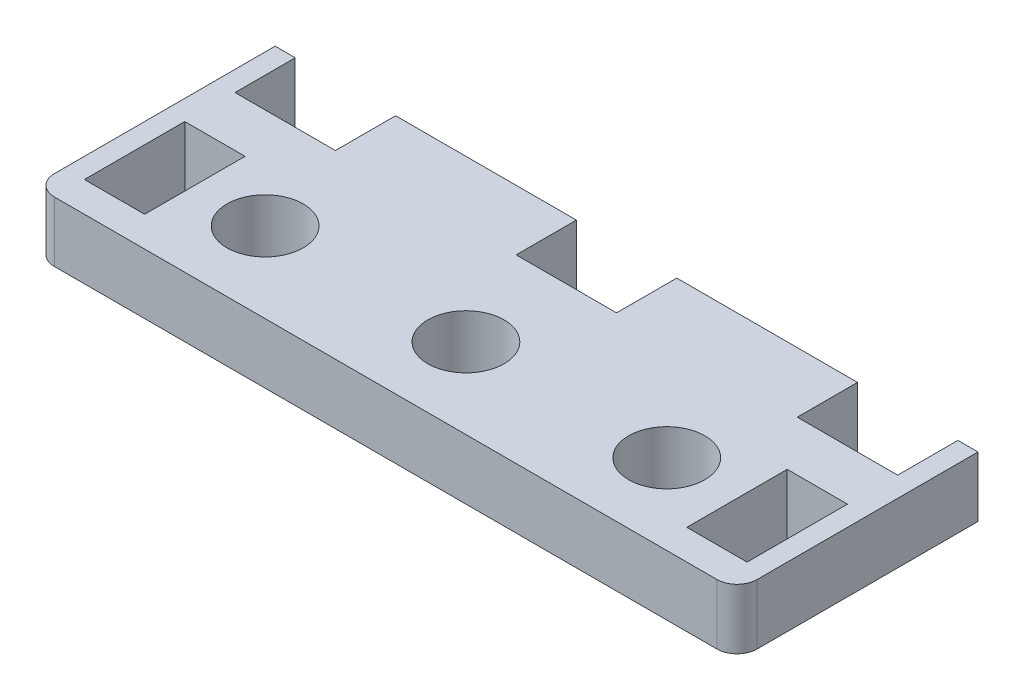
ISO-10303-21;
HEADER;
FILE_DESCRIPTION(('STEP AP214'),'2;1');
FILE_NAME('part.step','',(''),(''),'','','');
FILE_SCHEMA(('AUTOMOTIVE_DESIGN { 1 0 10303 214 1 1 1 1 }'));
ENDSEC;
DATA;
#1=APPLICATION_CONTEXT('core data for automotive mechanical design processes');
#2=APPLICATION_PROTOCOL_DEFINITION('international standard','automotive_design',2000,#1);
#3=PRODUCT_CONTEXT('',#1,'mechanical');
#4=PRODUCT('Part','Part','',(#3));
#5=PRODUCT_RELATED_PRODUCT_CATEGORY('part','',(#4));
#6=PRODUCT_DEFINITION_FORMATION('','',#4);
#7=PRODUCT_DEFINITION_CONTEXT('part definition',#1,'design');
#8=PRODUCT_DEFINITION('design','',#6,#7);
#9=PRODUCT_DEFINITION_SHAPE('','',#8);
#10=(LENGTH_UNIT() NAMED_UNIT(*) SI_UNIT(.MILLI.,.METRE.));
#11=(NAMED_UNIT(*) PLANE_ANGLE_UNIT() SI_UNIT($,.RADIAN.));
#12=(NAMED_UNIT(*) SI_UNIT($,.STERADIAN.) SOLID_ANGLE_UNIT());
#13=UNCERTAINTY_MEASURE_WITH_UNIT(LENGTH_MEASURE(1.E-05),#10,'distance_accuracy_value','');
#14=(GEOMETRIC_REPRESENTATION_CONTEXT(3) GLOBAL_UNCERTAINTY_ASSIGNED_CONTEXT((#13)) GLOBAL_UNIT_ASSIGNED_CONTEXT((#10,
#11,#12)) REPRESENTATION_CONTEXT('',''));
#15=CARTESIAN_POINT('',(0.,0.,0.));
#16=DIRECTION('',(0.,0.,1.));
#17=DIRECTION('',(1.,0.,0.));
#18=AXIS2_PLACEMENT_3D('',#15,#16,#17);
#19=CARTESIAN_POINT('',(-17.5,3.,-6.));
#20=DIRECTION('',(0.,0.,-1.));
#21=DIRECTION('',(-1.,0.,0.));
#22=AXIS2_PLACEMENT_3D('',#19,#20,#21);
#23=PLANE('',#22);
#24=DIRECTION('',(0.,1.,0.));
#25=VECTOR('',#24,1.);
#26=CARTESIAN_POINT('',(-2.5,0.,-6.));
#27=LINE('',#26,#25);
#28=CARTESIAN_POINT('',(-2.5,0.,-6.));
#29=VERTEX_POINT('',#28);
#30=CARTESIAN_POINT('',(-2.5,3.,-6.));
#31=VERTEX_POINT('',#30);
#32=EDGE_CURVE('E296',#29,#31,#27,.T.);
#33=ORIENTED_EDGE('',*,*,#32,.F.);
#34=DIRECTION('',(1.,0.,0.));
#35=VECTOR('',#34,1.);
#36=CARTESIAN_POINT('',(-17.5,0.,-6.));
#37=LINE('',#36,#35);
#38=CARTESIAN_POINT('',(-11.5,0.,-6.));
#39=VERTEX_POINT('',#38);
#40=EDGE_CURVE('E384',#39,#29,#37,.T.);
#41=ORIENTED_EDGE('',*,*,#40,.F.);
#42=DIRECTION('',(0.,1.,0.));
#43=VECTOR('',#42,1.);
#44=CARTESIAN_POINT('',(-11.5,0.,-6.));
#45=LINE('',#44,#43);
#46=CARTESIAN_POINT('',(-11.5,3.,-6.));
#47=VERTEX_POINT('',#46);
#48=EDGE_CURVE('E250',#39,#47,#45,.T.);
#49=ORIENTED_EDGE('',*,*,#48,.T.);
#50=DIRECTION('',(1.,0.,0.));
#51=VECTOR('',#50,1.);
#52=CARTESIAN_POINT('',(-17.5,3.,-6.));
#53=LINE('',#52,#51);
#54=EDGE_CURVE('E373',#47,#31,#53,.T.);
#55=ORIENTED_EDGE('',*,*,#54,.T.);
#56=EDGE_LOOP('',(#33,#41,#49,#55));
#57=FACE_BOUND('',#56,.T.);
#58=ADVANCED_FACE('F33',(#57),#23,.T.);
#59=DIRECTION('',(0.,1.,0.));
#60=VECTOR('',#59,1.);
#61=CARTESIAN_POINT('',(-16.5,0.,-6.));
#62=LINE('',#61,#60);
#63=CARTESIAN_POINT('',(-16.5,0.,-6.));
#64=VERTEX_POINT('',#63);
#65=CARTESIAN_POINT('',(-16.5,3.,-6.));
#66=VERTEX_POINT('',#65);
#67=EDGE_CURVE('E247',#64,#66,#62,.T.);
#68=ORIENTED_EDGE('',*,*,#67,.F.);
#69=CARTESIAN_POINT('',(-17.5,0.,-6.));
#70=VERTEX_POINT('',#69);
#71=EDGE_CURVE('E234',#70,#64,#37,.T.);
#72=ORIENTED_EDGE('',*,*,#71,.F.);
#73=DIRECTION('',(0.,-1.,0.));
#74=VECTOR('',#73,1.);
#75=CARTESIAN_POINT('',(-17.5,3.,-6.));
#76=LINE('',#75,#74);
#77=CARTESIAN_POINT('',(-17.5,3.,-6.));
#78=VERTEX_POINT('',#77);
#79=EDGE_CURVE('E390',#78,#70,#76,.T.);
#80=ORIENTED_EDGE('',*,*,#79,.F.);
#81=EDGE_CURVE('E369',#78,#66,#53,.T.);
#82=ORIENTED_EDGE('',*,*,#81,.T.);
#83=EDGE_LOOP('',(#68,#72,#80,#82));
#84=FACE_BOUND('',#83,.T.);
#85=ADVANCED_FACE('F426',(#84),#23,.T.);
#86=DIRECTION('',(0.,1.,0.));
#87=VECTOR('',#86,1.);
#88=CARTESIAN_POINT('',(2.5,0.,-6.));
#89=LINE('',#88,#87);
#90=CARTESIAN_POINT('',(2.5,0.,-6.));
#91=VERTEX_POINT('',#90);
#92=CARTESIAN_POINT('',(2.5,3.,-6.));
#93=VERTEX_POINT('',#92);
#94=EDGE_CURVE('E331',#91,#93,#89,.T.);
#95=ORIENTED_EDGE('',*,*,#94,.T.);
#96=CARTESIAN_POINT('',(11.5,3.,-6.));
#97=VERTEX_POINT('',#96);
#98=EDGE_CURVE('E444',#93,#97,#53,.T.);
#99=ORIENTED_EDGE('',*,*,#98,.T.);
#100=DIRECTION('',(0.,1.,0.));
#101=VECTOR('',#100,1.);
#102=CARTESIAN_POINT('',(11.5,0.,-6.));
#103=LINE('',#102,#101);
#104=CARTESIAN_POINT('',(11.5,0.,-6.));
#105=VERTEX_POINT('',#104);
#106=EDGE_CURVE('E245',#105,#97,#103,.T.);
#107=ORIENTED_EDGE('',*,*,#106,.F.);
#108=EDGE_CURVE('E437',#91,#105,#37,.T.);
#109=ORIENTED_EDGE('',*,*,#108,.F.);
#110=EDGE_LOOP('',(#95,#99,#107,#109));
#111=FACE_BOUND('',#110,.T.);
#112=ADVANCED_FACE('F449',(#111),#23,.T.);
#113=DIRECTION('',(0.,1.,0.));
#114=VECTOR('',#113,1.);
#115=CARTESIAN_POINT('',(16.5,0.,-6.));
#116=LINE('',#115,#114);
#117=CARTESIAN_POINT('',(16.5,0.,-6.));
#118=VERTEX_POINT('',#117);
#119=CARTESIAN_POINT('',(16.5,3.,-6.));
#120=VERTEX_POINT('',#119);
#121=EDGE_CURVE('E273',#118,#120,#116,.T.);
#122=ORIENTED_EDGE('',*,*,#121,.T.);
#123=CARTESIAN_POINT('',(17.5,3.,-6.));
#124=VERTEX_POINT('',#123);
#125=EDGE_CURVE('E374',#120,#124,#53,.T.);
#126=ORIENTED_EDGE('',*,*,#125,.T.);
#127=DIRECTION('',(0.,-1.,0.));
#128=VECTOR('',#127,1.);
#129=CARTESIAN_POINT('',(17.5,3.,-6.));
#130=LINE('',#129,#128);
#131=CARTESIAN_POINT('',(17.5,0.,-6.));
#132=VERTEX_POINT('',#131);
#133=EDGE_CURVE('E381',#124,#132,#130,.T.);
#134=ORIENTED_EDGE('',*,*,#133,.T.);
#135=EDGE_CURVE('E362',#118,#132,#37,.T.);
#136=ORIENTED_EDGE('',*,*,#135,.F.);
#137=EDGE_LOOP('',(#122,#126,#134,#136));
#138=FACE_BOUND('',#137,.T.);
#139=ADVANCED_FACE('F442',(#138),#23,.T.);
#140=CARTESIAN_POINT('',(-17.5,3.,-6.));
#141=DIRECTION('',(1.,0.,0.));
#142=DIRECTION('',(0.,0.,-1.));
#143=AXIS2_PLACEMENT_3D('',#140,#141,#142);
#144=PLANE('',#143);
#145=DIRECTION('',(0.,0.,1.));
#146=VECTOR('',#145,1.);
#147=CARTESIAN_POINT('',(-17.5,0.,-6.));
#148=LINE('',#147,#146);
#149=CARTESIAN_POINT('',(-17.5,0.,5.));
#150=VERTEX_POINT('',#149);
#151=EDGE_CURVE('E388',#70,#150,#148,.T.);
#152=ORIENTED_EDGE('',*,*,#151,.T.);
#153=DIRECTION('',(0.,-1.,0.));
#154=VECTOR('',#153,1.);
#155=CARTESIAN_POINT('',(-17.5,3.,5.));
#156=LINE('',#155,#154);
#157=CARTESIAN_POINT('',(-17.5,3.,5.));
#158=VERTEX_POINT('',#157);
#159=EDGE_CURVE('E11',#150,#158,#156,.F.);
#160=ORIENTED_EDGE('',*,*,#159,.T.);
#161=DIRECTION('',(0.,0.,1.));
#162=VECTOR('',#161,1.);
#163=CARTESIAN_POINT('',(-17.5,3.,-6.));
#164=LINE('',#163,#162);
#165=EDGE_CURVE('E379',#78,#158,#164,.T.);
#166=ORIENTED_EDGE('',*,*,#165,.F.);
#167=ORIENTED_EDGE('',*,*,#79,.T.);
#168=EDGE_LOOP('',(#152,#160,#166,#167));
#169=FACE_BOUND('',#168,.T.);
#170=ADVANCED_FACE('F423',(#169),#144,.F.);
#171=CARTESIAN_POINT('',(-17.5,3.,6.));
#172=DIRECTION('',(0.,0.,-1.));
#173=DIRECTION('',(-1.,0.,0.));
#174=AXIS2_PLACEMENT_3D('',#171,#172,#173);
#175=PLANE('',#174);
#176=DIRECTION('',(1.,0.,0.));
#177=VECTOR('',#176,1.);
#178=CARTESIAN_POINT('',(-17.5,0.,6.));
#179=LINE('',#178,#177);
#180=CARTESIAN_POINT('',(-16.5,0.,6.));
#181=VERTEX_POINT('',#180);
#182=CARTESIAN_POINT('',(16.5,0.,6.));
#183=VERTEX_POINT('',#182);
#184=EDGE_CURVE('E386',#181,#183,#179,.T.);
#185=ORIENTED_EDGE('',*,*,#184,.T.);
#186=DIRECTION('',(0.,-1.,0.));
#187=VECTOR('',#186,1.);
#188=CARTESIAN_POINT('',(16.5,3.,6.));
#189=LINE('',#188,#187);
#190=CARTESIAN_POINT('',(16.5,3.,6.));
#191=VERTEX_POINT('',#190);
#192=EDGE_CURVE('E54',#183,#191,#189,.F.);
#193=ORIENTED_EDGE('',*,*,#192,.T.);
#194=DIRECTION('',(1.,0.,0.));
#195=VECTOR('',#194,1.);
#196=CARTESIAN_POINT('',(-17.5,3.,6.));
#197=LINE('',#196,#195);
#198=CARTESIAN_POINT('',(-16.5,3.,6.));
#199=VERTEX_POINT('',#198);
#200=EDGE_CURVE('E377',#199,#191,#197,.T.);
#201=ORIENTED_EDGE('',*,*,#200,.F.);
#202=DIRECTION('',(0.,-1.,0.));
#203=VECTOR('',#202,1.);
#204=CARTESIAN_POINT('',(-16.5,3.,6.));
#205=LINE('',#204,#203);
#206=EDGE_CURVE('E401',#199,#181,#205,.T.);
#207=ORIENTED_EDGE('',*,*,#206,.T.);
#208=EDGE_LOOP('',(#185,#193,#201,#207));
#209=FACE_BOUND('',#208,.T.);
#210=ADVANCED_FACE('F419',(#209),#175,.F.);
#211=CARTESIAN_POINT('',(17.5,3.,-6.));
#212=DIRECTION('',(1.,0.,0.));
#213=DIRECTION('',(0.,0.,-1.));
#214=AXIS2_PLACEMENT_3D('',#211,#212,#213);
#215=PLANE('',#214);
#216=DIRECTION('',(0.,0.,1.));
#217=VECTOR('',#216,1.);
#218=CARTESIAN_POINT('',(17.5,3.,-6.));
#219=LINE('',#218,#217);
#220=CARTESIAN_POINT('',(17.5,3.,5.));
#221=VERTEX_POINT('',#220);
#222=EDGE_CURVE('E372',#124,#221,#219,.T.);
#223=ORIENTED_EDGE('',*,*,#222,.T.);
#224=DIRECTION('',(0.,-1.,0.));
#225=VECTOR('',#224,1.);
#226=CARTESIAN_POINT('',(17.5,0.,5.));
#227=LINE('',#226,#225);
#228=CARTESIAN_POINT('',(17.5,0.,5.));
#229=VERTEX_POINT('',#228);
#230=EDGE_CURVE('E392',#221,#229,#227,.T.);
#231=ORIENTED_EDGE('',*,*,#230,.T.);
#232=DIRECTION('',(0.,0.,1.));
#233=VECTOR('',#232,1.);
#234=CARTESIAN_POINT('',(17.5,0.,-6.));
#235=LINE('',#234,#233);
#236=EDGE_CURVE('E383',#132,#229,#235,.T.);
#237=ORIENTED_EDGE('',*,*,#236,.F.);
#238=ORIENTED_EDGE('',*,*,#133,.F.);
#239=EDGE_LOOP('',(#223,#231,#237,#238));
#240=FACE_BOUND('',#239,.T.);
#241=ADVANCED_FACE('F415',(#240),#215,.T.);
#242=CARTESIAN_POINT('',(0.,3.,0.));
#243=DIRECTION('',(0.,-1.,0.));
#244=DIRECTION('',(0.,0.,-1.));
#245=AXIS2_PLACEMENT_3D('',#242,#243,#244);
#246=PLANE('',#245);
#247=CARTESIAN_POINT('',(-10.,3.,2.));
#248=DIRECTION('',(0.,1.,0.));
#249=DIRECTION('',(0.,0.,1.));
#250=AXIS2_PLACEMENT_3D('',#247,#248,#249);
#251=CIRCLE('',#250,1.89864999999999);
#252=CARTESIAN_POINT('',(-10.,3.,3.89864999999999));
#253=VERTEX_POINT('',#252);
#254=EDGE_CURVE('E695',#253,#253,#251,.T.);
#255=ORIENTED_EDGE('',*,*,#254,.F.);
#256=EDGE_LOOP('',(#255));
#257=FACE_BOUND('',#256,.T.);
#258=CARTESIAN_POINT('',(0.,3.,2.));
#259=DIRECTION('',(0.,1.,0.));
#260=DIRECTION('',(0.,0.,1.));
#261=AXIS2_PLACEMENT_3D('',#258,#259,#260);
#262=CIRCLE('',#261,1.89864999999999);
#263=CARTESIAN_POINT('',(0.,3.,3.89864999999999));
#264=VERTEX_POINT('',#263);
#265=EDGE_CURVE('E698',#264,#264,#262,.T.);
#266=ORIENTED_EDGE('',*,*,#265,.F.);
#267=EDGE_LOOP('',(#266));
#268=FACE_BOUND('',#267,.T.);
#269=CARTESIAN_POINT('',(10.,3.,2.));
#270=DIRECTION('',(0.,1.,0.));
#271=DIRECTION('',(0.,0.,1.));
#272=AXIS2_PLACEMENT_3D('',#269,#270,#271);
#273=CIRCLE('',#272,1.89864999999999);
#274=CARTESIAN_POINT('',(10.,3.,3.89864999999999));
#275=VERTEX_POINT('',#274);
#276=EDGE_CURVE('E705',#275,#275,#273,.T.);
#277=ORIENTED_EDGE('',*,*,#276,.F.);
#278=EDGE_LOOP('',(#277));
#279=FACE_BOUND('',#278,.T.);
#280=DIRECTION('',(-1.,0.,0.));
#281=VECTOR('',#280,1.);
#282=CARTESIAN_POINT('',(13.5,3.,-0.499999999999998));
#283=LINE('',#282,#281);
#284=CARTESIAN_POINT('',(16.5,3.,-0.499999999999998));
#285=VERTEX_POINT('',#284);
#286=CARTESIAN_POINT('',(13.5,3.,-0.499999999999998));
#287=VERTEX_POINT('',#286);
#288=EDGE_CURVE('E295',#285,#287,#283,.T.);
#289=ORIENTED_EDGE('',*,*,#288,.F.);
#290=DIRECTION('',(0.,0.,-1.));
#291=VECTOR('',#290,1.);
#292=CARTESIAN_POINT('',(16.5,3.,-0.499999999999998));
#293=LINE('',#292,#291);
#294=CARTESIAN_POINT('',(16.5,3.,4.5));
#295=VERTEX_POINT('',#294);
#296=EDGE_CURVE('E293',#295,#285,#293,.T.);
#297=ORIENTED_EDGE('',*,*,#296,.F.);
#298=DIRECTION('',(1.,0.,0.));
#299=VECTOR('',#298,1.);
#300=CARTESIAN_POINT('',(13.5,3.,4.5));
#301=LINE('',#300,#299);
#302=CARTESIAN_POINT('',(13.5,3.,4.5));
#303=VERTEX_POINT('',#302);
#304=EDGE_CURVE('E283',#303,#295,#301,.T.);
#305=ORIENTED_EDGE('',*,*,#304,.F.);
#306=DIRECTION('',(0.,0.,1.));
#307=VECTOR('',#306,1.);
#308=CARTESIAN_POINT('',(13.5,3.,-0.499999999999998));
#309=LINE('',#308,#307);
#310=EDGE_CURVE('E299',#287,#303,#309,.T.);
#311=ORIENTED_EDGE('',*,*,#310,.F.);
#312=EDGE_LOOP('',(#289,#297,#305,#311));
#313=FACE_BOUND('',#312,.T.);
#314=DIRECTION('',(-1.,0.,0.));
#315=VECTOR('',#314,1.);
#316=CARTESIAN_POINT('',(-16.5,3.,-0.5));
#317=LINE('',#316,#315);
#318=CARTESIAN_POINT('',(-13.5,3.,-0.5));
#319=VERTEX_POINT('',#318);
#320=CARTESIAN_POINT('',(-16.5,3.,-0.5));
#321=VERTEX_POINT('',#320);
#322=EDGE_CURVE('E352',#319,#321,#317,.T.);
#323=ORIENTED_EDGE('',*,*,#322,.F.);
#324=DIRECTION('',(0.,0.,-1.));
#325=VECTOR('',#324,1.);
#326=CARTESIAN_POINT('',(-13.5,3.,-0.5));
#327=LINE('',#326,#325);
#328=CARTESIAN_POINT('',(-13.5,3.,4.5));
#329=VERTEX_POINT('',#328);
#330=EDGE_CURVE('E306',#329,#319,#327,.T.);
#331=ORIENTED_EDGE('',*,*,#330,.F.);
#332=DIRECTION('',(1.,0.,0.));
#333=VECTOR('',#332,1.);
#334=CARTESIAN_POINT('',(-16.5,3.,4.5));
#335=LINE('',#334,#333);
#336=CARTESIAN_POINT('',(-16.5,3.,4.5));
#337=VERTEX_POINT('',#336);
#338=EDGE_CURVE('E341',#337,#329,#335,.T.);
#339=ORIENTED_EDGE('',*,*,#338,.F.);
#340=DIRECTION('',(0.,0.,1.));
#341=VECTOR('',#340,1.);
#342=CARTESIAN_POINT('',(-16.5,3.,-0.5));
#343=LINE('',#342,#341);
#344=EDGE_CURVE('E355',#321,#337,#343,.T.);
#345=ORIENTED_EDGE('',*,*,#344,.F.);
#346=EDGE_LOOP('',(#323,#331,#339,#345));
#347=FACE_BOUND('',#346,.T.);
#348=ORIENTED_EDGE('',*,*,#200,.T.);
#349=CARTESIAN_POINT('',(16.5,3.,5.));
#350=DIRECTION('',(0.,-1.,0.));
#351=DIRECTION('',(0.,0.,-1.));
#352=AXIS2_PLACEMENT_3D('',#349,#350,#351);
#353=CIRCLE('',#352,1.);
#354=EDGE_CURVE('E41',#191,#221,#353,.F.);
#355=ORIENTED_EDGE('',*,*,#354,.T.);
#356=ORIENTED_EDGE('',*,*,#222,.F.);
#357=ORIENTED_EDGE('',*,*,#125,.F.);
#358=DIRECTION('',(0.,0.,-1.));
#359=VECTOR('',#358,1.);
#360=CARTESIAN_POINT('',(16.5,3.,-6.));
#361=LINE('',#360,#359);
#362=CARTESIAN_POINT('',(16.5,3.,-3.));
#363=VERTEX_POINT('',#362);
#364=EDGE_CURVE('E258',#363,#120,#361,.T.);
#365=ORIENTED_EDGE('',*,*,#364,.F.);
#366=DIRECTION('',(1.,0.,0.));
#367=VECTOR('',#366,1.);
#368=CARTESIAN_POINT('',(11.5,3.,-3.));
#369=LINE('',#368,#367);
#370=CARTESIAN_POINT('',(11.5,3.,-3.));
#371=VERTEX_POINT('',#370);
#372=EDGE_CURVE('E268',#371,#363,#369,.T.);
#373=ORIENTED_EDGE('',*,*,#372,.F.);
#374=DIRECTION('',(0.,0.,1.));
#375=VECTOR('',#374,1.);
#376=CARTESIAN_POINT('',(11.5,3.,-6.));
#377=LINE('',#376,#375);
#378=EDGE_CURVE('E265',#97,#371,#377,.T.);
#379=ORIENTED_EDGE('',*,*,#378,.F.);
#380=ORIENTED_EDGE('',*,*,#98,.F.);
#381=DIRECTION('',(0.,0.,-1.));
#382=VECTOR('',#381,1.);
#383=CARTESIAN_POINT('',(2.5,3.,-6.));
#384=LINE('',#383,#382);
#385=CARTESIAN_POINT('',(2.5,3.,-3.));
#386=VERTEX_POINT('',#385);
#387=EDGE_CURVE('E317',#386,#93,#384,.T.);
#388=ORIENTED_EDGE('',*,*,#387,.F.);
#389=DIRECTION('',(1.,0.,0.));
#390=VECTOR('',#389,1.);
#391=CARTESIAN_POINT('',(-2.5,3.,-3.));
#392=LINE('',#391,#390);
#393=CARTESIAN_POINT('',(-2.5,3.,-3.));
#394=VERTEX_POINT('',#393);
#395=EDGE_CURVE('E326',#394,#386,#392,.T.);
#396=ORIENTED_EDGE('',*,*,#395,.F.);
#397=DIRECTION('',(0.,0.,1.));
#398=VECTOR('',#397,1.);
#399=CARTESIAN_POINT('',(-2.5,3.,-6.));
#400=LINE('',#399,#398);
#401=EDGE_CURVE('E249',#31,#394,#400,.T.);
#402=ORIENTED_EDGE('',*,*,#401,.F.);
#403=ORIENTED_EDGE('',*,*,#54,.F.);
#404=DIRECTION('',(0.,0.,-1.));
#405=VECTOR('',#404,1.);
#406=CARTESIAN_POINT('',(-11.5,3.,-6.));
#407=LINE('',#406,#405);
#408=CARTESIAN_POINT('',(-11.5,3.,-3.));
#409=VERTEX_POINT('',#408);
#410=EDGE_CURVE('E235',#409,#47,#407,.T.);
#411=ORIENTED_EDGE('',*,*,#410,.F.);
#412=DIRECTION('',(1.,0.,0.));
#413=VECTOR('',#412,1.);
#414=CARTESIAN_POINT('',(-16.5,3.,-3.));
#415=LINE('',#414,#413);
#416=CARTESIAN_POINT('',(-16.5,3.,-3.));
#417=VERTEX_POINT('',#416);
#418=EDGE_CURVE('E237',#417,#409,#415,.T.);
#419=ORIENTED_EDGE('',*,*,#418,.F.);
#420=DIRECTION('',(0.,0.,1.));
#421=VECTOR('',#420,1.);
#422=CARTESIAN_POINT('',(-16.5,3.,-6.));
#423=LINE('',#422,#421);
#424=EDGE_CURVE('E214',#66,#417,#423,.T.);
#425=ORIENTED_EDGE('',*,*,#424,.F.);
#426=ORIENTED_EDGE('',*,*,#81,.F.);
#427=ORIENTED_EDGE('',*,*,#165,.T.);
#428=CARTESIAN_POINT('',(-16.5,3.,5.));
#429=DIRECTION('',(0.,-1.,0.));
#430=DIRECTION('',(0.,0.,-1.));
#431=AXIS2_PLACEMENT_3D('',#428,#429,#430);
#432=CIRCLE('',#431,1.);
#433=EDGE_CURVE('E405',#158,#199,#432,.F.);
#434=ORIENTED_EDGE('',*,*,#433,.T.);
#435=EDGE_LOOP('',(#348,#355,#356,#357,#365,#373,#379,#380,#388,#396,#402,#403,#411,#419,#425,
#426,#427,#434));
#436=FACE_BOUND('',#435,.T.);
#437=ADVANCED_FACE('F409',(#257,#268,#279,#313,#347,#436),#246,.F.);
#438=CARTESIAN_POINT('',(0.,0.,0.));
#439=DIRECTION('',(0.,-1.,0.));
#440=DIRECTION('',(0.,0.,-1.));
#441=AXIS2_PLACEMENT_3D('',#438,#439,#440);
#442=PLANE('',#441);
#443=CARTESIAN_POINT('',(-10.,0.,2.));
#444=DIRECTION('',(0.,1.,0.));
#445=DIRECTION('',(0.,0.,1.));
#446=AXIS2_PLACEMENT_3D('',#443,#444,#445);
#447=CIRCLE('',#446,1.89864999999999);
#448=CARTESIAN_POINT('',(-10.,0.,3.89864999999999));
#449=VERTEX_POINT('',#448);
#450=EDGE_CURVE('E692',#449,#449,#447,.T.);
#451=ORIENTED_EDGE('',*,*,#450,.T.);
#452=EDGE_LOOP('',(#451));
#453=FACE_BOUND('',#452,.T.);
#454=CARTESIAN_POINT('',(0.,0.,2.));
#455=DIRECTION('',(0.,1.,0.));
#456=DIRECTION('',(0.,0.,1.));
#457=AXIS2_PLACEMENT_3D('',#454,#455,#456);
#458=CIRCLE('',#457,1.89864999999999);
#459=CARTESIAN_POINT('',(0.,0.,3.89864999999999));
#460=VERTEX_POINT('',#459);
#461=EDGE_CURVE('E703',#460,#460,#458,.T.);
#462=ORIENTED_EDGE('',*,*,#461,.T.);
#463=EDGE_LOOP('',(#462));
#464=FACE_BOUND('',#463,.T.);
#465=CARTESIAN_POINT('',(10.,0.,2.));
#466=DIRECTION('',(0.,1.,0.));
#467=DIRECTION('',(0.,0.,1.));
#468=AXIS2_PLACEMENT_3D('',#465,#466,#467);
#469=CIRCLE('',#468,1.89864999999999);
#470=CARTESIAN_POINT('',(10.,0.,3.89864999999999));
#471=VERTEX_POINT('',#470);
#472=EDGE_CURVE('E240',#471,#471,#469,.T.);
#473=ORIENTED_EDGE('',*,*,#472,.T.);
#474=EDGE_LOOP('',(#473));
#475=FACE_BOUND('',#474,.T.);
#476=DIRECTION('',(0.,0.,-1.));
#477=VECTOR('',#476,1.);
#478=CARTESIAN_POINT('',(16.5,0.,-0.499999999999998));
#479=LINE('',#478,#477);
#480=CARTESIAN_POINT('',(16.5,0.,4.5));
#481=VERTEX_POINT('',#480);
#482=CARTESIAN_POINT('',(16.5,0.,-0.499999999999998));
#483=VERTEX_POINT('',#482);
#484=EDGE_CURVE('E279',#481,#483,#479,.T.);
#485=ORIENTED_EDGE('',*,*,#484,.T.);
#486=DIRECTION('',(-1.,0.,0.));
#487=VECTOR('',#486,1.);
#488=CARTESIAN_POINT('',(13.5,0.,-0.499999999999998));
#489=LINE('',#488,#487);
#490=CARTESIAN_POINT('',(13.5,0.,-0.499999999999998));
#491=VERTEX_POINT('',#490);
#492=EDGE_CURVE('E282',#483,#491,#489,.T.);
#493=ORIENTED_EDGE('',*,*,#492,.T.);
#494=DIRECTION('',(0.,0.,1.));
#495=VECTOR('',#494,1.);
#496=CARTESIAN_POINT('',(13.5,0.,-0.499999999999998));
#497=LINE('',#496,#495);
#498=CARTESIAN_POINT('',(13.5,0.,4.5));
#499=VERTEX_POINT('',#498);
#500=EDGE_CURVE('E286',#491,#499,#497,.T.);
#501=ORIENTED_EDGE('',*,*,#500,.T.);
#502=DIRECTION('',(1.,0.,0.));
#503=VECTOR('',#502,1.);
#504=CARTESIAN_POINT('',(13.5,0.,4.5));
#505=LINE('',#504,#503);
#506=EDGE_CURVE('E289',#499,#481,#505,.T.);
#507=ORIENTED_EDGE('',*,*,#506,.T.);
#508=EDGE_LOOP('',(#485,#493,#501,#507));
#509=FACE_BOUND('',#508,.T.);
#510=ORIENTED_EDGE('',*,*,#236,.T.);
#511=CARTESIAN_POINT('',(16.5,0.,5.));
#512=DIRECTION('',(0.,-1.,0.));
#513=DIRECTION('',(0.,0.,-1.));
#514=AXIS2_PLACEMENT_3D('',#511,#512,#513);
#515=CIRCLE('',#514,1.);
#516=EDGE_CURVE('E399',#229,#183,#515,.T.);
#517=ORIENTED_EDGE('',*,*,#516,.T.);
#518=ORIENTED_EDGE('',*,*,#184,.F.);
#519=CARTESIAN_POINT('',(-16.5,0.,5.));
#520=DIRECTION('',(0.,-1.,0.));
#521=DIRECTION('',(0.,0.,-1.));
#522=AXIS2_PLACEMENT_3D('',#519,#520,#521);
#523=CIRCLE('',#522,1.);
#524=EDGE_CURVE('E397',#181,#150,#523,.T.);
#525=ORIENTED_EDGE('',*,*,#524,.T.);
#526=ORIENTED_EDGE('',*,*,#151,.F.);
#527=ORIENTED_EDGE('',*,*,#71,.T.);
#528=DIRECTION('',(0.,0.,1.));
#529=VECTOR('',#528,1.);
#530=CARTESIAN_POINT('',(-16.5,0.,-6.));
#531=LINE('',#530,#529);
#532=CARTESIAN_POINT('',(-16.5,0.,-3.));
#533=VERTEX_POINT('',#532);
#534=EDGE_CURVE('E211',#64,#533,#531,.T.);
#535=ORIENTED_EDGE('',*,*,#534,.T.);
#536=DIRECTION('',(1.,0.,0.));
#537=VECTOR('',#536,1.);
#538=CARTESIAN_POINT('',(-16.5,0.,-3.));
#539=LINE('',#538,#537);
#540=CARTESIAN_POINT('',(-11.5,0.,-3.));
#541=VERTEX_POINT('',#540);
#542=EDGE_CURVE('E223',#533,#541,#539,.T.);
#543=ORIENTED_EDGE('',*,*,#542,.T.);
#544=DIRECTION('',(0.,0.,-1.));
#545=VECTOR('',#544,1.);
#546=CARTESIAN_POINT('',(-11.5,0.,-6.));
#547=LINE('',#546,#545);
#548=EDGE_CURVE('E219',#541,#39,#547,.T.);
#549=ORIENTED_EDGE('',*,*,#548,.T.);
#550=ORIENTED_EDGE('',*,*,#40,.T.);
#551=DIRECTION('',(0.,0.,1.));
#552=VECTOR('',#551,1.);
#553=CARTESIAN_POINT('',(-2.5,0.,-6.));
#554=LINE('',#553,#552);
#555=CARTESIAN_POINT('',(-2.5,0.,-3.));
#556=VERTEX_POINT('',#555);
#557=EDGE_CURVE('E313',#29,#556,#554,.T.);
#558=ORIENTED_EDGE('',*,*,#557,.T.);
#559=DIRECTION('',(1.,0.,0.));
#560=VECTOR('',#559,1.);
#561=CARTESIAN_POINT('',(-2.5,0.,-3.));
#562=LINE('',#561,#560);
#563=CARTESIAN_POINT('',(2.5,0.,-3.));
#564=VERTEX_POINT('',#563);
#565=EDGE_CURVE('E316',#556,#564,#562,.T.);
#566=ORIENTED_EDGE('',*,*,#565,.T.);
#567=DIRECTION('',(0.,0.,-1.));
#568=VECTOR('',#567,1.);
#569=CARTESIAN_POINT('',(2.5,0.,-6.));
#570=LINE('',#569,#568);
#571=EDGE_CURVE('E320',#564,#91,#570,.T.);
#572=ORIENTED_EDGE('',*,*,#571,.T.);
#573=ORIENTED_EDGE('',*,*,#108,.T.);
#574=DIRECTION('',(0.,0.,1.));
#575=VECTOR('',#574,1.);
#576=CARTESIAN_POINT('',(11.5,0.,-6.));
#577=LINE('',#576,#575);
#578=CARTESIAN_POINT('',(11.5,0.,-3.));
#579=VERTEX_POINT('',#578);
#580=EDGE_CURVE('E254',#105,#579,#577,.T.);
#581=ORIENTED_EDGE('',*,*,#580,.T.);
#582=DIRECTION('',(1.,0.,0.));
#583=VECTOR('',#582,1.);
#584=CARTESIAN_POINT('',(11.5,0.,-3.));
#585=LINE('',#584,#583);
#586=CARTESIAN_POINT('',(16.5,0.,-3.));
#587=VERTEX_POINT('',#586);
#588=EDGE_CURVE('E257',#579,#587,#585,.T.);
#589=ORIENTED_EDGE('',*,*,#588,.T.);
#590=DIRECTION('',(0.,0.,-1.));
#591=VECTOR('',#590,1.);
#592=CARTESIAN_POINT('',(16.5,0.,-6.));
#593=LINE('',#592,#591);
#594=EDGE_CURVE('E261',#587,#118,#593,.T.);
#595=ORIENTED_EDGE('',*,*,#594,.T.);
#596=ORIENTED_EDGE('',*,*,#135,.T.);
#597=EDGE_LOOP('',(#510,#517,#518,#525,#526,#527,#535,#543,#549,#550,#558,#566,#572,#573,#581,
#589,#595,#596));
#598=FACE_BOUND('',#597,.T.);
#599=DIRECTION('',(0.,0.,-1.));
#600=VECTOR('',#599,1.);
#601=CARTESIAN_POINT('',(-13.5,0.,-0.5));
#602=LINE('',#601,#600);
#603=CARTESIAN_POINT('',(-13.5,0.,4.5));
#604=VERTEX_POINT('',#603);
#605=CARTESIAN_POINT('',(-13.5,0.,-0.5));
#606=VERTEX_POINT('',#605);
#607=EDGE_CURVE('E337',#604,#606,#602,.T.);
#608=ORIENTED_EDGE('',*,*,#607,.T.);
#609=DIRECTION('',(-1.,0.,0.));
#610=VECTOR('',#609,1.);
#611=CARTESIAN_POINT('',(-16.5,0.,-0.5));
#612=LINE('',#611,#610);
#613=CARTESIAN_POINT('',(-16.5,0.,-0.5));
#614=VERTEX_POINT('',#613);
#615=EDGE_CURVE('E340',#606,#614,#612,.T.);
#616=ORIENTED_EDGE('',*,*,#615,.T.);
#617=DIRECTION('',(0.,0.,1.));
#618=VECTOR('',#617,1.);
#619=CARTESIAN_POINT('',(-16.5,0.,-0.5));
#620=LINE('',#619,#618);
#621=CARTESIAN_POINT('',(-16.5,0.,4.5));
#622=VERTEX_POINT('',#621);
#623=EDGE_CURVE('E344',#614,#622,#620,.T.);
#624=ORIENTED_EDGE('',*,*,#623,.T.);
#625=DIRECTION('',(1.,0.,0.));
#626=VECTOR('',#625,1.);
#627=CARTESIAN_POINT('',(-16.5,0.,4.5));
#628=LINE('',#627,#626);
#629=EDGE_CURVE('E347',#622,#604,#628,.T.);
#630=ORIENTED_EDGE('',*,*,#629,.T.);
#631=EDGE_LOOP('',(#608,#616,#624,#630));
#632=FACE_BOUND('',#631,.T.);
#633=ADVANCED_FACE('F230',(#453,#464,#475,#509,#598,#632),#442,.T.);
#634=CARTESIAN_POINT('',(-13.5,0.,-0.5));
#635=DIRECTION('',(1.,0.,0.));
#636=DIRECTION('',(0.,0.,-1.));
#637=AXIS2_PLACEMENT_3D('',#634,#635,#636);
#638=PLANE('',#637);
#639=ORIENTED_EDGE('',*,*,#330,.T.);
#640=DIRECTION('',(0.,1.,0.));
#641=VECTOR('',#640,1.);
#642=CARTESIAN_POINT('',(-13.5,0.,-0.5));
#643=LINE('',#642,#641);
#644=EDGE_CURVE('E350',#606,#319,#643,.T.);
#645=ORIENTED_EDGE('',*,*,#644,.F.);
#646=ORIENTED_EDGE('',*,*,#607,.F.);
#647=DIRECTION('',(0.,1.,0.));
#648=VECTOR('',#647,1.);
#649=CARTESIAN_POINT('',(-13.5,0.,4.5));
#650=LINE('',#649,#648);
#651=EDGE_CURVE('E360',#604,#329,#650,.T.);
#652=ORIENTED_EDGE('',*,*,#651,.T.);
#653=EDGE_LOOP('',(#639,#645,#646,#652));
#654=FACE_BOUND('',#653,.T.);
#655=ADVANCED_FACE('F499',(#654),#638,.F.);
#656=CARTESIAN_POINT('',(-16.5,0.,4.5));
#657=DIRECTION('',(0.,0.,1.));
#658=DIRECTION('',(1.,0.,0.));
#659=AXIS2_PLACEMENT_3D('',#656,#657,#658);
#660=PLANE('',#659);
#661=ORIENTED_EDGE('',*,*,#338,.T.);
#662=ORIENTED_EDGE('',*,*,#651,.F.);
#663=ORIENTED_EDGE('',*,*,#629,.F.);
#664=DIRECTION('',(0.,1.,0.));
#665=VECTOR('',#664,1.);
#666=CARTESIAN_POINT('',(-16.5,0.,4.5));
#667=LINE('',#666,#665);
#668=EDGE_CURVE('E363',#622,#337,#667,.T.);
#669=ORIENTED_EDGE('',*,*,#668,.T.);
#670=EDGE_LOOP('',(#661,#662,#663,#669));
#671=FACE_BOUND('',#670,.T.);
#672=ADVANCED_FACE('F505',(#671),#660,.F.);
#673=CARTESIAN_POINT('',(-16.5,0.,-0.5));
#674=DIRECTION('',(-1.,0.,0.));
#675=DIRECTION('',(0.,0.,1.));
#676=AXIS2_PLACEMENT_3D('',#673,#674,#675);
#677=PLANE('',#676);
#678=ORIENTED_EDGE('',*,*,#344,.T.);
#679=ORIENTED_EDGE('',*,*,#668,.F.);
#680=ORIENTED_EDGE('',*,*,#623,.F.);
#681=DIRECTION('',(0.,1.,0.));
#682=VECTOR('',#681,1.);
#683=CARTESIAN_POINT('',(-16.5,0.,-0.5));
#684=LINE('',#683,#682);
#685=EDGE_CURVE('E365',#614,#321,#684,.T.);
#686=ORIENTED_EDGE('',*,*,#685,.T.);
#687=EDGE_LOOP('',(#678,#679,#680,#686));
#688=FACE_BOUND('',#687,.T.);
#689=ADVANCED_FACE('F514',(#688),#677,.F.);
#690=CARTESIAN_POINT('',(-16.5,0.,-0.5));
#691=DIRECTION('',(0.,0.,-1.));
#692=DIRECTION('',(-1.,0.,0.));
#693=AXIS2_PLACEMENT_3D('',#690,#691,#692);
#694=PLANE('',#693);
#695=ORIENTED_EDGE('',*,*,#322,.T.);
#696=ORIENTED_EDGE('',*,*,#685,.F.);
#697=ORIENTED_EDGE('',*,*,#615,.F.);
#698=ORIENTED_EDGE('',*,*,#644,.T.);
#699=EDGE_LOOP('',(#695,#696,#697,#698));
#700=FACE_BOUND('',#699,.T.);
#701=ADVANCED_FACE('F469',(#700),#694,.F.);
#702=CARTESIAN_POINT('',(11.5,0.,-6.));
#703=DIRECTION('',(-1.,0.,0.));
#704=DIRECTION('',(0.,0.,1.));
#705=AXIS2_PLACEMENT_3D('',#702,#703,#704);
#706=PLANE('',#705);
#707=ORIENTED_EDGE('',*,*,#378,.T.);
#708=DIRECTION('',(0.,1.,0.));
#709=VECTOR('',#708,1.);
#710=CARTESIAN_POINT('',(11.5,0.,-3.));
#711=LINE('',#710,#709);
#712=EDGE_CURVE('E264',#579,#371,#711,.T.);
#713=ORIENTED_EDGE('',*,*,#712,.F.);
#714=ORIENTED_EDGE('',*,*,#580,.F.);
#715=ORIENTED_EDGE('',*,*,#106,.T.);
#716=EDGE_LOOP('',(#707,#713,#714,#715));
#717=FACE_BOUND('',#716,.T.);
#718=ADVANCED_FACE('F455',(#717),#706,.F.);
#719=CARTESIAN_POINT('',(16.5,0.,-6.));
#720=DIRECTION('',(1.,0.,0.));
#721=DIRECTION('',(0.,0.,-1.));
#722=AXIS2_PLACEMENT_3D('',#719,#720,#721);
#723=PLANE('',#722);
#724=ORIENTED_EDGE('',*,*,#364,.T.);
#725=ORIENTED_EDGE('',*,*,#121,.F.);
#726=ORIENTED_EDGE('',*,*,#594,.F.);
#727=DIRECTION('',(0.,1.,0.));
#728=VECTOR('',#727,1.);
#729=CARTESIAN_POINT('',(16.5,0.,-3.));
#730=LINE('',#729,#728);
#731=EDGE_CURVE('E276',#587,#363,#730,.T.);
#732=ORIENTED_EDGE('',*,*,#731,.T.);
#733=EDGE_LOOP('',(#724,#725,#726,#732));
#734=FACE_BOUND('',#733,.T.);
#735=ADVANCED_FACE('F461',(#734),#723,.F.);
#736=CARTESIAN_POINT('',(11.5,0.,-3.));
#737=DIRECTION('',(0.,0.,1.));
#738=DIRECTION('',(1.,0.,0.));
#739=AXIS2_PLACEMENT_3D('',#736,#737,#738);
#740=PLANE('',#739);
#741=ORIENTED_EDGE('',*,*,#372,.T.);
#742=ORIENTED_EDGE('',*,*,#731,.F.);
#743=ORIENTED_EDGE('',*,*,#588,.F.);
#744=ORIENTED_EDGE('',*,*,#712,.T.);
#745=EDGE_LOOP('',(#741,#742,#743,#744));
#746=FACE_BOUND('',#745,.T.);
#747=ADVANCED_FACE('F459',(#746),#740,.F.);
#748=CARTESIAN_POINT('',(-16.5,0.,-6.));
#749=DIRECTION('',(-1.,0.,0.));
#750=DIRECTION('',(0.,0.,1.));
#751=AXIS2_PLACEMENT_3D('',#748,#749,#750);
#752=PLANE('',#751);
#753=ORIENTED_EDGE('',*,*,#424,.T.);
#754=DIRECTION('',(0.,1.,0.));
#755=VECTOR('',#754,1.);
#756=CARTESIAN_POINT('',(-16.5,0.,-3.));
#757=LINE('',#756,#755);
#758=EDGE_CURVE('E207',#533,#417,#757,.T.);
#759=ORIENTED_EDGE('',*,*,#758,.F.);
#760=ORIENTED_EDGE('',*,*,#534,.F.);
#761=ORIENTED_EDGE('',*,*,#67,.T.);
#762=EDGE_LOOP('',(#753,#759,#760,#761));
#763=FACE_BOUND('',#762,.T.);
#764=ADVANCED_FACE('F209',(#763),#752,.F.);
#765=CARTESIAN_POINT('',(-11.5,0.,-6.));
#766=DIRECTION('',(1.,0.,0.));
#767=DIRECTION('',(0.,0.,-1.));
#768=AXIS2_PLACEMENT_3D('',#765,#766,#767);
#769=PLANE('',#768);
#770=ORIENTED_EDGE('',*,*,#410,.T.);
#771=ORIENTED_EDGE('',*,*,#48,.F.);
#772=ORIENTED_EDGE('',*,*,#548,.F.);
#773=DIRECTION('',(0.,1.,0.));
#774=VECTOR('',#773,1.);
#775=CARTESIAN_POINT('',(-11.5,0.,-3.));
#776=LINE('',#775,#774);
#777=EDGE_CURVE('E218',#541,#409,#776,.T.);
#778=ORIENTED_EDGE('',*,*,#777,.T.);
#779=EDGE_LOOP('',(#770,#771,#772,#778));
#780=FACE_BOUND('',#779,.T.);
#781=ADVANCED_FACE('F432',(#780),#769,.F.);
#782=CARTESIAN_POINT('',(-16.5,0.,-3.));
#783=DIRECTION('',(0.,0.,1.));
#784=DIRECTION('',(1.,0.,0.));
#785=AXIS2_PLACEMENT_3D('',#782,#783,#784);
#786=PLANE('',#785);
#787=ORIENTED_EDGE('',*,*,#418,.T.);
#788=ORIENTED_EDGE('',*,*,#777,.F.);
#789=ORIENTED_EDGE('',*,*,#542,.F.);
#790=ORIENTED_EDGE('',*,*,#758,.T.);
#791=EDGE_LOOP('',(#787,#788,#789,#790));
#792=FACE_BOUND('',#791,.T.);
#793=ADVANCED_FACE('F224',(#792),#786,.F.);
#794=CARTESIAN_POINT('',(-2.5,0.,-6.));
#795=DIRECTION('',(-1.,0.,0.));
#796=DIRECTION('',(0.,0.,1.));
#797=AXIS2_PLACEMENT_3D('',#794,#795,#796);
#798=PLANE('',#797);
#799=ORIENTED_EDGE('',*,*,#401,.T.);
#800=DIRECTION('',(0.,1.,0.));
#801=VECTOR('',#800,1.);
#802=CARTESIAN_POINT('',(-2.5,0.,-3.));
#803=LINE('',#802,#801);
#804=EDGE_CURVE('E323',#556,#394,#803,.T.);
#805=ORIENTED_EDGE('',*,*,#804,.F.);
#806=ORIENTED_EDGE('',*,*,#557,.F.);
#807=ORIENTED_EDGE('',*,*,#32,.T.);
#808=EDGE_LOOP('',(#799,#805,#806,#807));
#809=FACE_BOUND('',#808,.T.);
#810=ADVANCED_FACE('F566',(#809),#798,.F.);
#811=CARTESIAN_POINT('',(2.5,0.,-6.));
#812=DIRECTION('',(1.,0.,0.));
#813=DIRECTION('',(0.,0.,-1.));
#814=AXIS2_PLACEMENT_3D('',#811,#812,#813);
#815=PLANE('',#814);
#816=ORIENTED_EDGE('',*,*,#387,.T.);
#817=ORIENTED_EDGE('',*,*,#94,.F.);
#818=ORIENTED_EDGE('',*,*,#571,.F.);
#819=DIRECTION('',(0.,1.,0.));
#820=VECTOR('',#819,1.);
#821=CARTESIAN_POINT('',(2.5,0.,-3.));
#822=LINE('',#821,#820);
#823=EDGE_CURVE('E334',#564,#386,#822,.T.);
#824=ORIENTED_EDGE('',*,*,#823,.T.);
#825=EDGE_LOOP('',(#816,#817,#818,#824));
#826=FACE_BOUND('',#825,.T.);
#827=ADVANCED_FACE('F574',(#826),#815,.F.);
#828=CARTESIAN_POINT('',(-2.5,0.,-3.));
#829=DIRECTION('',(0.,0.,1.));
#830=DIRECTION('',(1.,0.,0.));
#831=AXIS2_PLACEMENT_3D('',#828,#829,#830);
#832=PLANE('',#831);
#833=ORIENTED_EDGE('',*,*,#395,.T.);
#834=ORIENTED_EDGE('',*,*,#823,.F.);
#835=ORIENTED_EDGE('',*,*,#565,.F.);
#836=ORIENTED_EDGE('',*,*,#804,.T.);
#837=EDGE_LOOP('',(#833,#834,#835,#836));
#838=FACE_BOUND('',#837,.T.);
#839=ADVANCED_FACE('F583',(#838),#832,.F.);
#840=CARTESIAN_POINT('',(16.5,0.,-0.499999999999998));
#841=DIRECTION('',(1.,0.,0.));
#842=DIRECTION('',(0.,0.,-1.));
#843=AXIS2_PLACEMENT_3D('',#840,#841,#842);
#844=PLANE('',#843);
#845=ORIENTED_EDGE('',*,*,#296,.T.);
#846=DIRECTION('',(0.,1.,0.));
#847=VECTOR('',#846,1.);
#848=CARTESIAN_POINT('',(16.5,0.,-0.499999999999998));
#849=LINE('',#848,#847);
#850=EDGE_CURVE('E292',#483,#285,#849,.T.);
#851=ORIENTED_EDGE('',*,*,#850,.F.);
#852=ORIENTED_EDGE('',*,*,#484,.F.);
#853=DIRECTION('',(0.,1.,0.));
#854=VECTOR('',#853,1.);
#855=CARTESIAN_POINT('',(16.5,0.,4.5));
#856=LINE('',#855,#854);
#857=EDGE_CURVE('E304',#481,#295,#856,.T.);
#858=ORIENTED_EDGE('',*,*,#857,.T.);
#859=EDGE_LOOP('',(#845,#851,#852,#858));
#860=FACE_BOUND('',#859,.T.);
#861=ADVANCED_FACE('F592',(#860),#844,.F.);
#862=CARTESIAN_POINT('',(13.5,0.,4.5));
#863=DIRECTION('',(0.,0.,1.));
#864=DIRECTION('',(1.,0.,0.));
#865=AXIS2_PLACEMENT_3D('',#862,#863,#864);
#866=PLANE('',#865);
#867=ORIENTED_EDGE('',*,*,#304,.T.);
#868=ORIENTED_EDGE('',*,*,#857,.F.);
#869=ORIENTED_EDGE('',*,*,#506,.F.);
#870=DIRECTION('',(0.,1.,0.));
#871=VECTOR('',#870,1.);
#872=CARTESIAN_POINT('',(13.5,0.,4.5));
#873=LINE('',#872,#871);
#874=EDGE_CURVE('E307',#499,#303,#873,.T.);
#875=ORIENTED_EDGE('',*,*,#874,.T.);
#876=EDGE_LOOP('',(#867,#868,#869,#875));
#877=FACE_BOUND('',#876,.T.);
#878=ADVANCED_FACE('F601',(#877),#866,.F.);
#879=CARTESIAN_POINT('',(13.5,0.,-0.499999999999998));
#880=DIRECTION('',(-1.,0.,0.));
#881=DIRECTION('',(0.,0.,1.));
#882=AXIS2_PLACEMENT_3D('',#879,#880,#881);
#883=PLANE('',#882);
#884=ORIENTED_EDGE('',*,*,#310,.T.);
#885=ORIENTED_EDGE('',*,*,#874,.F.);
#886=ORIENTED_EDGE('',*,*,#500,.F.);
#887=DIRECTION('',(0.,1.,0.));
#888=VECTOR('',#887,1.);
#889=CARTESIAN_POINT('',(13.5,0.,-0.499999999999998));
#890=LINE('',#889,#888);
#891=EDGE_CURVE('E309',#491,#287,#890,.T.);
#892=ORIENTED_EDGE('',*,*,#891,.T.);
#893=EDGE_LOOP('',(#884,#885,#886,#892));
#894=FACE_BOUND('',#893,.T.);
#895=ADVANCED_FACE('F610',(#894),#883,.F.);
#896=CARTESIAN_POINT('',(13.5,0.,-0.499999999999998));
#897=DIRECTION('',(0.,0.,-1.));
#898=DIRECTION('',(-1.,0.,0.));
#899=AXIS2_PLACEMENT_3D('',#896,#897,#898);
#900=PLANE('',#899);
#901=ORIENTED_EDGE('',*,*,#288,.T.);
#902=ORIENTED_EDGE('',*,*,#891,.F.);
#903=ORIENTED_EDGE('',*,*,#492,.F.);
#904=ORIENTED_EDGE('',*,*,#850,.T.);
#905=EDGE_LOOP('',(#901,#902,#903,#904));
#906=FACE_BOUND('',#905,.T.);
#907=ADVANCED_FACE('F619',(#906),#900,.F.);
#908=CARTESIAN_POINT('',(16.5,3.,5.));
#909=DIRECTION('',(0.,1.,0.));
#910=DIRECTION('',(0.,0.,1.));
#911=AXIS2_PLACEMENT_3D('',#908,#909,#910);
#912=CYLINDRICAL_SURFACE('',#911,1.);
#913=ORIENTED_EDGE('',*,*,#354,.F.);
#914=ORIENTED_EDGE('',*,*,#192,.F.);
#915=ORIENTED_EDGE('',*,*,#516,.F.);
#916=ORIENTED_EDGE('',*,*,#230,.F.);
#917=EDGE_LOOP('',(#913,#914,#915,#916));
#918=FACE_BOUND('',#917,.T.);
#919=ADVANCED_FACE('F417',(#918),#912,.T.);
#920=CARTESIAN_POINT('',(-16.5,3.,5.));
#921=DIRECTION('',(0.,-1.,0.));
#922=DIRECTION('',(0.,0.,-1.));
#923=AXIS2_PLACEMENT_3D('',#920,#921,#922);
#924=CYLINDRICAL_SURFACE('',#923,1.);
#925=ORIENTED_EDGE('',*,*,#433,.F.);
#926=ORIENTED_EDGE('',*,*,#159,.F.);
#927=ORIENTED_EDGE('',*,*,#524,.F.);
#928=ORIENTED_EDGE('',*,*,#206,.F.);
#929=EDGE_LOOP('',(#925,#926,#927,#928));
#930=FACE_BOUND('',#929,.T.);
#931=ADVANCED_FACE('F35',(#930),#924,.T.);
#932=CARTESIAN_POINT('',(10.,3.,2.));
#933=DIRECTION('',(0.,1.,0.));
#934=DIRECTION('',(0.,0.,1.));
#935=AXIS2_PLACEMENT_3D('',#932,#933,#934);
#936=CYLINDRICAL_SURFACE('',#935,1.89864999999999);
#937=ORIENTED_EDGE('',*,*,#472,.F.);
#938=EDGE_LOOP('',(#937));
#939=FACE_BOUND('',#938,.T.);
#940=ORIENTED_EDGE('',*,*,#276,.T.);
#941=EDGE_LOOP('',(#940));
#942=FACE_BOUND('',#941,.T.);
#943=ADVANCED_FACE('F644',(#939,#942),#936,.F.);
#944=CARTESIAN_POINT('',(0.,3.,2.));
#945=DIRECTION('',(0.,1.,0.));
#946=DIRECTION('',(0.,0.,1.));
#947=AXIS2_PLACEMENT_3D('',#944,#945,#946);
#948=CYLINDRICAL_SURFACE('',#947,1.89864999999999);
#949=ORIENTED_EDGE('',*,*,#461,.F.);
#950=EDGE_LOOP('',(#949));
#951=FACE_BOUND('',#950,.T.);
#952=ORIENTED_EDGE('',*,*,#265,.T.);
#953=EDGE_LOOP('',(#952));
#954=FACE_BOUND('',#953,.T.);
#955=ADVANCED_FACE('F652',(#951,#954),#948,.F.);
#956=CARTESIAN_POINT('',(-10.,3.,2.));
#957=DIRECTION('',(0.,1.,0.));
#958=DIRECTION('',(0.,0.,1.));
#959=AXIS2_PLACEMENT_3D('',#956,#957,#958);
#960=CYLINDRICAL_SURFACE('',#959,1.89864999999999);
#961=ORIENTED_EDGE('',*,*,#450,.F.);
#962=EDGE_LOOP('',(#961));
#963=FACE_BOUND('',#962,.T.);
#964=ORIENTED_EDGE('',*,*,#254,.T.);
#965=EDGE_LOOP('',(#964));
#966=FACE_BOUND('',#965,.T.);
#967=ADVANCED_FACE('F662',(#963,#966),#960,.F.);
#968=CLOSED_SHELL('',(#58,#85,#112,#139,#170,#210,#241,#437,#633,#655,#672,#689,#701,#718,#735,
#747,#764,#781,#793,#810,#827,#839,#861,#878,#895,#907,#919,#931,#943,#955,#967));
#969=MANIFOLD_SOLID_BREP('B2',#968);
#970=ADVANCED_BREP_SHAPE_REPRESENTATION('',(#18,#969),#14);
#971=SHAPE_DEFINITION_REPRESENTATION(#9,#970);
ENDSEC;
END-ISO-10303-21;
